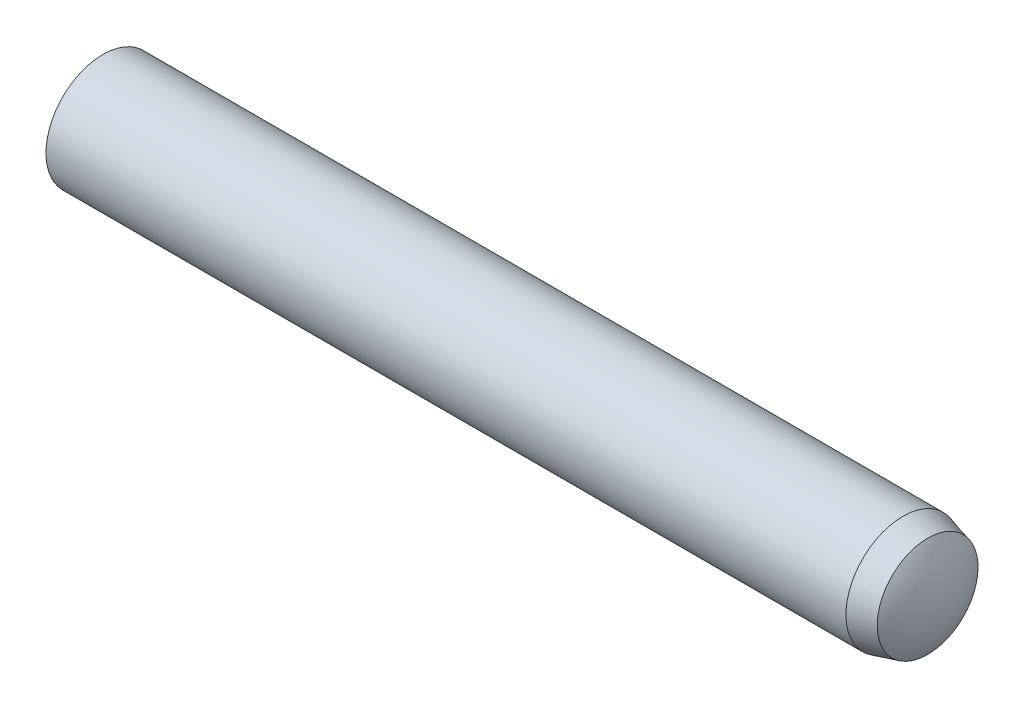
ISO-10303-21;
HEADER;
FILE_DESCRIPTION(('STEP AP214'),'2;1');
FILE_NAME('part.step','',(''),(''),'','','');
FILE_SCHEMA(('AUTOMOTIVE_DESIGN { 1 0 10303 214 1 1 1 1 }'));
ENDSEC;
DATA;
#1=APPLICATION_CONTEXT('core data for automotive mechanical design processes');
#2=APPLICATION_PROTOCOL_DEFINITION('international standard','automotive_design',2000,#1);
#3=PRODUCT_CONTEXT('',#1,'mechanical');
#4=PRODUCT('Part','Part','',(#3));
#5=PRODUCT_RELATED_PRODUCT_CATEGORY('part','',(#4));
#6=PRODUCT_DEFINITION_FORMATION('','',#4);
#7=PRODUCT_DEFINITION_CONTEXT('part definition',#1,'design');
#8=PRODUCT_DEFINITION('design','',#6,#7);
#9=PRODUCT_DEFINITION_SHAPE('','',#8);
#10=(LENGTH_UNIT() NAMED_UNIT(*) SI_UNIT(.MILLI.,.METRE.));
#11=(NAMED_UNIT(*) PLANE_ANGLE_UNIT() SI_UNIT($,.RADIAN.));
#12=(NAMED_UNIT(*) SI_UNIT($,.STERADIAN.) SOLID_ANGLE_UNIT());
#13=UNCERTAINTY_MEASURE_WITH_UNIT(LENGTH_MEASURE(1.E-05),#10,'distance_accuracy_value','');
#14=(GEOMETRIC_REPRESENTATION_CONTEXT(3) GLOBAL_UNCERTAINTY_ASSIGNED_CONTEXT((#13)) GLOBAL_UNIT_ASSIGNED_CONTEXT((#10,
#11,#12)) REPRESENTATION_CONTEXT('',''));
#15=CARTESIAN_POINT('',(0.,0.,0.));
#16=DIRECTION('',(0.,0.,1.));
#17=DIRECTION('',(1.,0.,0.));
#18=AXIS2_PLACEMENT_3D('',#15,#16,#17);
#19=CARTESIAN_POINT('',(40.2054169750802,0.,0.));
#20=DIRECTION('',(1.,0.,0.));
#21=DIRECTION('',(0.,1.,0.));
#22=AXIS2_PLACEMENT_3D('',#19,#20,#21);
#23=SPHERICAL_SURFACE('',#22,4.79458302491976);
#24=CARTESIAN_POINT('',(45.,0.,0.));
#25=VERTEX_POINT('',#24);
#26=VERTEX_LOOP('',#25);
#27=FACE_BOUND('',#26,.T.);
#28=CARTESIAN_POINT('',(44.1999999999894,0.,0.));
#29=DIRECTION('',(-1.,0.,0.));
#30=DIRECTION('',(0.,1.,0.));
#31=AXIS2_PLACEMENT_3D('',#28,#29,#30);
#32=CIRCLE('',#31,2.65166605007038);
#33=CARTESIAN_POINT('',(44.1999999999894,2.65166605007039,0.));
#34=VERTEX_POINT('',#33);
#35=EDGE_CURVE('E37',#34,#34,#32,.T.);
#36=ORIENTED_EDGE('',*,*,#35,.F.);
#37=EDGE_LOOP('',(#36));
#38=FACE_BOUND('',#37,.T.);
#39=ADVANCED_FACE('F17',(#27,#38),#23,.T.);
#40=CARTESIAN_POINT('',(42.9000000001452,0.,0.));
#41=DIRECTION('',(-1.,0.,0.));
#42=DIRECTION('',(0.,0.,1.));
#43=AXIS2_PLACEMENT_3D('',#40,#41,#42);
#44=CONICAL_SURFACE('',#43,2.99999999975852,0.261799387487196);
#45=CARTESIAN_POINT('',(42.9,0.,0.));
#46=DIRECTION('',(1.,0.,0.));
#47=DIRECTION('',(0.,1.,0.));
#48=AXIS2_PLACEMENT_3D('',#45,#46,#47);
#49=CIRCLE('',#48,3.);
#50=CARTESIAN_POINT('',(42.9,3.00000000000001,0.));
#51=VERTEX_POINT('',#50);
#52=EDGE_CURVE('E26',#51,#51,#49,.F.);
#53=ORIENTED_EDGE('',*,*,#52,.F.);
#54=EDGE_LOOP('',(#53));
#55=FACE_BOUND('',#54,.T.);
#56=ORIENTED_EDGE('',*,*,#35,.T.);
#57=EDGE_LOOP('',(#56));
#58=FACE_BOUND('',#57,.T.);
#59=ADVANCED_FACE('F34',(#55,#58),#44,.T.);
#60=CARTESIAN_POINT('',(6.025,0.,0.));
#61=DIRECTION('',(1.,0.,0.));
#62=DIRECTION('',(0.,1.,0.));
#63=AXIS2_PLACEMENT_3D('',#60,#61,#62);
#64=SPHERICAL_SURFACE('',#63,6.025);
#65=CARTESIAN_POINT('',(0.,0.,0.));
#66=VERTEX_POINT('',#65);
#67=VERTEX_LOOP('',#66);
#68=FACE_BOUND('',#67,.T.);
#69=CARTESIAN_POINT('',(0.799999999999999,0.,0.));
#70=DIRECTION('',(1.,0.,0.));
#71=DIRECTION('',(0.,1.,0.));
#72=AXIS2_PLACEMENT_3D('',#69,#70,#71);
#73=CIRCLE('',#72,3.);
#74=CARTESIAN_POINT('',(0.799999999999998,3.,0.));
#75=VERTEX_POINT('',#74);
#76=EDGE_CURVE('E11',#75,#75,#73,.T.);
#77=ORIENTED_EDGE('',*,*,#76,.F.);
#78=EDGE_LOOP('',(#77));
#79=FACE_BOUND('',#78,.T.);
#80=ADVANCED_FACE('F48',(#68,#79),#64,.T.);
#81=CARTESIAN_POINT('',(21.85,0.,0.));
#82=DIRECTION('',(1.,0.,0.));
#83=DIRECTION('',(0.,1.,0.));
#84=AXIS2_PLACEMENT_3D('',#81,#82,#83);
#85=CYLINDRICAL_SURFACE('',#84,3.);
#86=ORIENTED_EDGE('',*,*,#76,.T.);
#87=EDGE_LOOP('',(#86));
#88=FACE_BOUND('',#87,.T.);
#89=ORIENTED_EDGE('',*,*,#52,.T.);
#90=EDGE_LOOP('',(#89));
#91=FACE_BOUND('',#90,.T.);
#92=ADVANCED_FACE('F51',(#88,#91),#85,.T.);
#93=CLOSED_SHELL('',(#39,#59,#80,#92));
#94=MANIFOLD_SOLID_BREP('B1',#93);
#95=ADVANCED_BREP_SHAPE_REPRESENTATION('',(#18,#94),#14);
#96=SHAPE_DEFINITION_REPRESENTATION(#9,#95);
ENDSEC;
END-ISO-10303-21;
